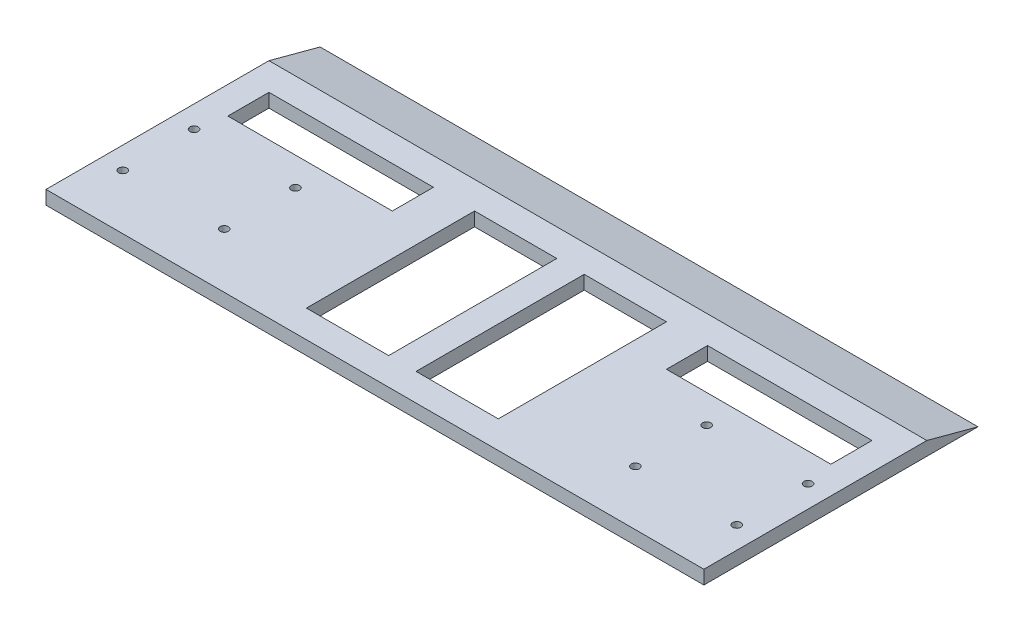
ISO-10303-21;
HEADER;
FILE_DESCRIPTION(('STEP AP214'),'2;1');
FILE_NAME('part.step','',(''),(''),'','','');
FILE_SCHEMA(('AUTOMOTIVE_DESIGN { 1 0 10303 214 1 1 1 1 }'));
ENDSEC;
DATA;
#1=APPLICATION_CONTEXT('core data for automotive mechanical design processes');
#2=APPLICATION_PROTOCOL_DEFINITION('international standard','automotive_design',2000,#1);
#3=PRODUCT_CONTEXT('',#1,'mechanical');
#4=PRODUCT('Part','Part','',(#3));
#5=PRODUCT_RELATED_PRODUCT_CATEGORY('part','',(#4));
#6=PRODUCT_DEFINITION_FORMATION('','',#4);
#7=PRODUCT_DEFINITION_CONTEXT('part definition',#1,'design');
#8=PRODUCT_DEFINITION('design','',#6,#7);
#9=PRODUCT_DEFINITION_SHAPE('','',#8);
#10=(LENGTH_UNIT() NAMED_UNIT(*) SI_UNIT(.MILLI.,.METRE.));
#11=(NAMED_UNIT(*) PLANE_ANGLE_UNIT() SI_UNIT($,.RADIAN.));
#12=(NAMED_UNIT(*) SI_UNIT($,.STERADIAN.) SOLID_ANGLE_UNIT());
#13=UNCERTAINTY_MEASURE_WITH_UNIT(LENGTH_MEASURE(1.E-05),#10,'distance_accuracy_value','');
#14=(GEOMETRIC_REPRESENTATION_CONTEXT(3) GLOBAL_UNCERTAINTY_ASSIGNED_CONTEXT((#13)) GLOBAL_UNIT_ASSIGNED_CONTEXT((#10,
#11,#12)) REPRESENTATION_CONTEXT('',''));
#15=CARTESIAN_POINT('',(0.,0.,0.));
#16=DIRECTION('',(0.,0.,1.));
#17=DIRECTION('',(1.,0.,0.));
#18=AXIS2_PLACEMENT_3D('',#15,#16,#17);
#19=CARTESIAN_POINT('',(85.,-7.5,28.6602540378449));
#20=DIRECTION('',(0.,0.,-1.));
#21=DIRECTION('',(-1.,0.,0.));
#22=AXIS2_PLACEMENT_3D('',#19,#20,#21);
#23=PLANE('',#22);
#24=DIRECTION('',(0.,-1.,0.));
#25=VECTOR('',#24,1.);
#26=CARTESIAN_POINT('',(115.,2.49999999999999,28.6602540378449));
#27=LINE('',#26,#25);
#28=CARTESIAN_POINT('',(115.,2.49999999999999,28.6602540378449));
#29=VERTEX_POINT('',#28);
#30=CARTESIAN_POINT('',(115.,-2.5,28.6602540378449));
#31=VERTEX_POINT('',#30);
#32=EDGE_CURVE('E187',#29,#31,#27,.T.);
#33=ORIENTED_EDGE('',*,*,#32,.F.);
#34=DIRECTION('',(-1.,0.,0.));
#35=VECTOR('',#34,1.);
#36=CARTESIAN_POINT('',(85.,2.5,28.6602540378449));
#37=LINE('',#36,#35);
#38=CARTESIAN_POINT('',(85.,2.5,28.6602540378449));
#39=VERTEX_POINT('',#38);
#40=EDGE_CURVE('E175',#29,#39,#37,.T.);
#41=ORIENTED_EDGE('',*,*,#40,.T.);
#42=DIRECTION('',(0.,1.,0.));
#43=VECTOR('',#42,1.);
#44=CARTESIAN_POINT('',(85.,-7.5,28.6602540378449));
#45=LINE('',#44,#43);
#46=CARTESIAN_POINT('',(85.,-2.5,28.6602540378449));
#47=VERTEX_POINT('',#46);
#48=EDGE_CURVE('E252',#47,#39,#45,.T.);
#49=ORIENTED_EDGE('',*,*,#48,.F.);
#50=DIRECTION('',(-1.,0.,0.));
#51=VECTOR('',#50,1.);
#52=CARTESIAN_POINT('',(0.,-2.5,28.6602540378449));
#53=LINE('',#52,#51);
#54=EDGE_CURVE('E52',#31,#47,#53,.T.);
#55=ORIENTED_EDGE('',*,*,#54,.F.);
#56=EDGE_LOOP('',(#33,#41,#49,#55));
#57=FACE_BOUND('',#56,.T.);
#58=ADVANCED_FACE('F36',(#57),#23,.F.);
#59=DIRECTION('',(0.,1.,0.));
#60=VECTOR('',#59,1.);
#61=CARTESIAN_POINT('',(125.,2.5,28.6602540378449));
#62=LINE('',#61,#60);
#63=CARTESIAN_POINT('',(125.,-2.5,28.6602540378449));
#64=VERTEX_POINT('',#63);
#65=CARTESIAN_POINT('',(125.,2.5,28.6602540378449));
#66=VERTEX_POINT('',#65);
#67=EDGE_CURVE('E60',#64,#66,#62,.T.);
#68=ORIENTED_EDGE('',*,*,#67,.F.);
#69=CARTESIAN_POINT('',(155.,-2.5,28.6602540378449));
#70=VERTEX_POINT('',#69);
#71=EDGE_CURVE('E322',#70,#64,#53,.T.);
#72=ORIENTED_EDGE('',*,*,#71,.F.);
#73=DIRECTION('',(0.,1.,0.));
#74=VECTOR('',#73,1.);
#75=CARTESIAN_POINT('',(155.,-7.5,28.6602540378449));
#76=LINE('',#75,#74);
#77=CARTESIAN_POINT('',(155.,2.5,28.6602540378449));
#78=VERTEX_POINT('',#77);
#79=EDGE_CURVE('E255',#70,#78,#76,.T.);
#80=ORIENTED_EDGE('',*,*,#79,.T.);
#81=EDGE_CURVE('E183',#78,#66,#37,.T.);
#82=ORIENTED_EDGE('',*,*,#81,.T.);
#83=EDGE_LOOP('',(#68,#72,#80,#82));
#84=FACE_BOUND('',#83,.T.);
#85=ADVANCED_FACE('F452',(#84),#23,.F.);
#86=CARTESIAN_POINT('',(85.,-7.5,90.));
#87=DIRECTION('',(0.,0.,1.));
#88=DIRECTION('',(1.,0.,0.));
#89=AXIS2_PLACEMENT_3D('',#86,#87,#88);
#90=PLANE('',#89);
#91=DIRECTION('',(0.,1.,0.));
#92=VECTOR('',#91,1.);
#93=CARTESIAN_POINT('',(115.,-7.5,90.));
#94=LINE('',#93,#92);
#95=CARTESIAN_POINT('',(115.,-2.5,90.));
#96=VERTEX_POINT('',#95);
#97=CARTESIAN_POINT('',(115.,2.5,90.));
#98=VERTEX_POINT('',#97);
#99=EDGE_CURVE('E193',#96,#98,#94,.T.);
#100=ORIENTED_EDGE('',*,*,#99,.F.);
#101=DIRECTION('',(1.,0.,0.));
#102=VECTOR('',#101,1.);
#103=CARTESIAN_POINT('',(0.,-2.5,90.));
#104=LINE('',#103,#102);
#105=CARTESIAN_POINT('',(85.,-2.5,90.));
#106=VERTEX_POINT('',#105);
#107=EDGE_CURVE('E316',#106,#96,#104,.T.);
#108=ORIENTED_EDGE('',*,*,#107,.F.);
#109=DIRECTION('',(0.,1.,0.));
#110=VECTOR('',#109,1.);
#111=CARTESIAN_POINT('',(85.,-7.5,90.));
#112=LINE('',#111,#110);
#113=CARTESIAN_POINT('',(85.,2.5,90.));
#114=VERTEX_POINT('',#113);
#115=EDGE_CURVE('E251',#106,#114,#112,.T.);
#116=ORIENTED_EDGE('',*,*,#115,.T.);
#117=DIRECTION('',(1.,0.,0.));
#118=VECTOR('',#117,1.);
#119=CARTESIAN_POINT('',(85.,2.5,90.));
#120=LINE('',#119,#118);
#121=EDGE_CURVE('E247',#114,#98,#120,.T.);
#122=ORIENTED_EDGE('',*,*,#121,.T.);
#123=EDGE_LOOP('',(#100,#108,#116,#122));
#124=FACE_BOUND('',#123,.T.);
#125=ADVANCED_FACE('F457',(#124),#90,.F.);
#126=DIRECTION('',(0.,-1.,0.));
#127=VECTOR('',#126,1.);
#128=CARTESIAN_POINT('',(125.,-7.5,90.));
#129=LINE('',#128,#127);
#130=CARTESIAN_POINT('',(125.,2.5,90.));
#131=VERTEX_POINT('',#130);
#132=CARTESIAN_POINT('',(125.,-2.5,90.));
#133=VERTEX_POINT('',#132);
#134=EDGE_CURVE('E351',#131,#133,#129,.T.);
#135=ORIENTED_EDGE('',*,*,#134,.F.);
#136=CARTESIAN_POINT('',(155.,2.5,90.));
#137=VERTEX_POINT('',#136);
#138=EDGE_CURVE('E246',#131,#137,#120,.T.);
#139=ORIENTED_EDGE('',*,*,#138,.T.);
#140=DIRECTION('',(0.,1.,0.));
#141=VECTOR('',#140,1.);
#142=CARTESIAN_POINT('',(155.,-7.5,90.));
#143=LINE('',#142,#141);
#144=CARTESIAN_POINT('',(155.,-2.5,90.));
#145=VERTEX_POINT('',#144);
#146=EDGE_CURVE('E257',#145,#137,#143,.T.);
#147=ORIENTED_EDGE('',*,*,#146,.F.);
#148=EDGE_CURVE('E315',#133,#145,#104,.T.);
#149=ORIENTED_EDGE('',*,*,#148,.F.);
#150=EDGE_LOOP('',(#135,#139,#147,#149));
#151=FACE_BOUND('',#150,.T.);
#152=ADVANCED_FACE('F469',(#151),#90,.F.);
#153=CARTESIAN_POINT('',(0.,2.5,0.));
#154=DIRECTION('',(1.,0.,0.));
#155=DIRECTION('',(0.,0.,-1.));
#156=AXIS2_PLACEMENT_3D('',#153,#154,#155);
#157=PLANE('',#156);
#158=DIRECTION('',(0.,0.,1.));
#159=VECTOR('',#158,1.);
#160=CARTESIAN_POINT('',(0.,2.5,0.));
#161=LINE('',#160,#159);
#162=CARTESIAN_POINT('',(0.,2.5,18.6602540378449));
#163=VERTEX_POINT('',#162);
#164=CARTESIAN_POINT('',(0.,2.5,100.));
#165=VERTEX_POINT('',#164);
#166=EDGE_CURVE('E293',#163,#165,#161,.T.);
#167=ORIENTED_EDGE('',*,*,#166,.F.);
#168=DIRECTION('',(0.,-0.258819045102514,-0.96592582628907));
#169=VECTOR('',#168,1.);
#170=CARTESIAN_POINT('',(0.,-2.5,0.));
#171=LINE('',#170,#169);
#172=CARTESIAN_POINT('',(0.,-2.5,0.));
#173=VERTEX_POINT('',#172);
#174=EDGE_CURVE('E286',#163,#173,#171,.T.);
#175=ORIENTED_EDGE('',*,*,#174,.T.);
#176=DIRECTION('',(0.,0.,1.));
#177=VECTOR('',#176,1.);
#178=CARTESIAN_POINT('',(0.,-2.5,0.));
#179=LINE('',#178,#177);
#180=CARTESIAN_POINT('',(0.,-2.5,100.));
#181=VERTEX_POINT('',#180);
#182=EDGE_CURVE('E292',#173,#181,#179,.T.);
#183=ORIENTED_EDGE('',*,*,#182,.T.);
#184=DIRECTION('',(0.,-1.,0.));
#185=VECTOR('',#184,1.);
#186=CARTESIAN_POINT('',(0.,2.5,100.));
#187=LINE('',#186,#185);
#188=EDGE_CURVE('E312',#165,#181,#187,.T.);
#189=ORIENTED_EDGE('',*,*,#188,.F.);
#190=EDGE_LOOP('',(#167,#175,#183,#189));
#191=FACE_BOUND('',#190,.T.);
#192=ADVANCED_FACE('F516',(#191),#157,.F.);
#193=CARTESIAN_POINT('',(0.,2.5,100.));
#194=DIRECTION('',(0.,0.,-1.));
#195=DIRECTION('',(-1.,0.,0.));
#196=AXIS2_PLACEMENT_3D('',#193,#194,#195);
#197=PLANE('',#196);
#198=DIRECTION('',(1.,0.,0.));
#199=VECTOR('',#198,1.);
#200=CARTESIAN_POINT('',(0.,-2.5,100.));
#201=LINE('',#200,#199);
#202=CARTESIAN_POINT('',(240.,-2.5,100.));
#203=VERTEX_POINT('',#202);
#204=EDGE_CURVE('E304',#181,#203,#201,.T.);
#205=ORIENTED_EDGE('',*,*,#204,.T.);
#206=DIRECTION('',(0.,-1.,0.));
#207=VECTOR('',#206,1.);
#208=CARTESIAN_POINT('',(240.,2.5,100.));
#209=LINE('',#208,#207);
#210=CARTESIAN_POINT('',(240.,2.5,100.));
#211=VERTEX_POINT('',#210);
#212=EDGE_CURVE('E301',#211,#203,#209,.T.);
#213=ORIENTED_EDGE('',*,*,#212,.F.);
#214=DIRECTION('',(1.,0.,0.));
#215=VECTOR('',#214,1.);
#216=CARTESIAN_POINT('',(0.,2.5,100.));
#217=LINE('',#216,#215);
#218=EDGE_CURVE('E295',#165,#211,#217,.T.);
#219=ORIENTED_EDGE('',*,*,#218,.F.);
#220=ORIENTED_EDGE('',*,*,#188,.T.);
#221=EDGE_LOOP('',(#205,#213,#219,#220));
#222=FACE_BOUND('',#221,.T.);
#223=ADVANCED_FACE('F512',(#222),#197,.F.);
#224=CARTESIAN_POINT('',(240.,2.5,0.));
#225=DIRECTION('',(-1.,0.,0.));
#226=DIRECTION('',(0.,0.,1.));
#227=AXIS2_PLACEMENT_3D('',#224,#225,#226);
#228=PLANE('',#227);
#229=DIRECTION('',(0.,0.,-1.));
#230=VECTOR('',#229,1.);
#231=CARTESIAN_POINT('',(240.,-2.5,0.));
#232=LINE('',#231,#230);
#233=CARTESIAN_POINT('',(240.,-2.5,0.));
#234=VERTEX_POINT('',#233);
#235=EDGE_CURVE('E306',#203,#234,#232,.T.);
#236=ORIENTED_EDGE('',*,*,#235,.T.);
#237=DIRECTION('',(0.,-0.258819045102514,-0.96592582628907));
#238=VECTOR('',#237,1.);
#239=CARTESIAN_POINT('',(240.,-2.5,0.));
#240=LINE('',#239,#238);
#241=CARTESIAN_POINT('',(240.,2.5,18.6602540378449));
#242=VERTEX_POINT('',#241);
#243=EDGE_CURVE('E285',#242,#234,#240,.T.);
#244=ORIENTED_EDGE('',*,*,#243,.F.);
#245=DIRECTION('',(0.,0.,-1.));
#246=VECTOR('',#245,1.);
#247=CARTESIAN_POINT('',(240.,2.5,0.));
#248=LINE('',#247,#246);
#249=EDGE_CURVE('E298',#211,#242,#248,.T.);
#250=ORIENTED_EDGE('',*,*,#249,.F.);
#251=ORIENTED_EDGE('',*,*,#212,.T.);
#252=EDGE_LOOP('',(#236,#244,#250,#251));
#253=FACE_BOUND('',#252,.T.);
#254=ADVANCED_FACE('F508',(#253),#228,.F.);
#255=CARTESIAN_POINT('',(0.,2.5,0.));
#256=DIRECTION('',(0.,1.,0.));
#257=DIRECTION('',(0.,0.,1.));
#258=AXIS2_PLACEMENT_3D('',#255,#256,#257);
#259=PLANE('',#258);
#260=DIRECTION('',(0.,0.,-1.));
#261=VECTOR('',#260,1.);
#262=CARTESIAN_POINT('',(115.,2.49999999999999,98.6602540378449));
#263=LINE('',#262,#261);
#264=EDGE_CURVE('E180',#98,#29,#263,.T.);
#265=ORIENTED_EDGE('',*,*,#264,.F.);
#266=ORIENTED_EDGE('',*,*,#121,.F.);
#267=DIRECTION('',(0.,0.,1.));
#268=VECTOR('',#267,1.);
#269=CARTESIAN_POINT('',(85.,2.5,28.6602540378449));
#270=LINE('',#269,#268);
#271=EDGE_CURVE('E181',#39,#114,#270,.T.);
#272=ORIENTED_EDGE('',*,*,#271,.F.);
#273=ORIENTED_EDGE('',*,*,#40,.F.);
#274=EDGE_LOOP('',(#265,#266,#272,#273));
#275=FACE_BOUND('',#274,.T.);
#276=ORIENTED_EDGE('',*,*,#138,.F.);
#277=DIRECTION('',(0.,0.,-1.));
#278=VECTOR('',#277,1.);
#279=CARTESIAN_POINT('',(125.,2.5,98.6602540378449));
#280=LINE('',#279,#278);
#281=EDGE_CURVE('E194',#131,#66,#280,.T.);
#282=ORIENTED_EDGE('',*,*,#281,.T.);
#283=ORIENTED_EDGE('',*,*,#81,.F.);
#284=DIRECTION('',(0.,0.,-1.));
#285=VECTOR('',#284,1.);
#286=CARTESIAN_POINT('',(155.,2.5,28.6602540378449));
#287=LINE('',#286,#285);
#288=EDGE_CURVE('E184',#137,#78,#287,.T.);
#289=ORIENTED_EDGE('',*,*,#288,.F.);
#290=EDGE_LOOP('',(#276,#282,#283,#289));
#291=FACE_BOUND('',#290,.T.);
#292=DIRECTION('',(0.,0.,-1.));
#293=VECTOR('',#292,1.);
#294=CARTESIAN_POINT('',(70.,2.5,28.6602540378449));
#295=LINE('',#294,#293);
#296=CARTESIAN_POINT('',(70.,2.5,43.6602540378449));
#297=VERTEX_POINT('',#296);
#298=CARTESIAN_POINT('',(70.,2.5,28.6602540378449));
#299=VERTEX_POINT('',#298);
#300=EDGE_CURVE('E206',#297,#299,#295,.T.);
#301=ORIENTED_EDGE('',*,*,#300,.F.);
#302=DIRECTION('',(1.,0.,0.));
#303=VECTOR('',#302,1.);
#304=CARTESIAN_POINT('',(70.,2.5,43.6602540378449));
#305=LINE('',#304,#303);
#306=CARTESIAN_POINT('',(10.,2.5,43.6602540378449));
#307=VERTEX_POINT('',#306);
#308=EDGE_CURVE('E215',#307,#297,#305,.T.);
#309=ORIENTED_EDGE('',*,*,#308,.F.);
#310=DIRECTION('',(0.,0.,1.));
#311=VECTOR('',#310,1.);
#312=CARTESIAN_POINT('',(10.,2.5,28.6602540378449));
#313=LINE('',#312,#311);
#314=CARTESIAN_POINT('',(10.,2.5,28.6602540378449));
#315=VERTEX_POINT('',#314);
#316=EDGE_CURVE('E212',#315,#307,#313,.T.);
#317=ORIENTED_EDGE('',*,*,#316,.F.);
#318=DIRECTION('',(-1.,0.,0.));
#319=VECTOR('',#318,1.);
#320=CARTESIAN_POINT('',(70.,2.5,28.6602540378449));
#321=LINE('',#320,#319);
#322=EDGE_CURVE('E208',#299,#315,#321,.T.);
#323=ORIENTED_EDGE('',*,*,#322,.F.);
#324=EDGE_LOOP('',(#301,#309,#317,#323));
#325=FACE_BOUND('',#324,.T.);
#326=DIRECTION('',(0.,0.,1.));
#327=VECTOR('',#326,1.);
#328=CARTESIAN_POINT('',(170.,2.5,28.6602540378449));
#329=LINE('',#328,#327);
#330=CARTESIAN_POINT('',(170.,2.5,28.6602540378449));
#331=VERTEX_POINT('',#330);
#332=CARTESIAN_POINT('',(170.,2.5,43.6602540378449));
#333=VERTEX_POINT('',#332);
#334=EDGE_CURVE('E205',#331,#333,#329,.T.);
#335=ORIENTED_EDGE('',*,*,#334,.F.);
#336=DIRECTION('',(-1.,0.,0.));
#337=VECTOR('',#336,1.);
#338=CARTESIAN_POINT('',(170.,2.5,28.6602540378449));
#339=LINE('',#338,#337);
#340=CARTESIAN_POINT('',(230.,2.5,28.6602540378449));
#341=VERTEX_POINT('',#340);
#342=EDGE_CURVE('E234',#341,#331,#339,.T.);
#343=ORIENTED_EDGE('',*,*,#342,.F.);
#344=DIRECTION('',(0.,0.,-1.));
#345=VECTOR('',#344,1.);
#346=CARTESIAN_POINT('',(230.,2.5,28.6602540378449));
#347=LINE('',#346,#345);
#348=CARTESIAN_POINT('',(230.,2.5,43.6602540378449));
#349=VERTEX_POINT('',#348);
#350=EDGE_CURVE('E231',#349,#341,#347,.T.);
#351=ORIENTED_EDGE('',*,*,#350,.F.);
#352=DIRECTION('',(1.,0.,0.));
#353=VECTOR('',#352,1.);
#354=CARTESIAN_POINT('',(170.,2.5,43.6602540378449));
#355=LINE('',#354,#353);
#356=EDGE_CURVE('E228',#333,#349,#355,.T.);
#357=ORIENTED_EDGE('',*,*,#356,.F.);
#358=EDGE_LOOP('',(#335,#343,#351,#357));
#359=FACE_BOUND('',#358,.T.);
#360=CARTESIAN_POINT('',(195.,2.5,80.));
#361=DIRECTION('',(0.,1.,0.));
#362=DIRECTION('',(0.,0.,-1.));
#363=AXIS2_PLACEMENT_3D('',#360,#361,#362);
#364=CIRCLE('',#363,1.50000000000003);
#365=CARTESIAN_POINT('',(195.,2.5,78.5));
#366=VERTEX_POINT('',#365);
#367=EDGE_CURVE('E268',#366,#366,#364,.T.);
#368=ORIENTED_EDGE('',*,*,#367,.F.);
#369=EDGE_LOOP('',(#368));
#370=FACE_BOUND('',#369,.T.);
#371=CARTESIAN_POINT('',(8.00000000000001,2.5,54.));
#372=DIRECTION('',(0.,1.,0.));
#373=DIRECTION('',(0.,0.,1.));
#374=AXIS2_PLACEMENT_3D('',#371,#372,#373);
#375=CIRCLE('',#374,1.5);
#376=CARTESIAN_POINT('',(8.00000000000001,2.5,55.5));
#377=VERTEX_POINT('',#376);
#378=EDGE_CURVE('E271',#377,#377,#375,.T.);
#379=ORIENTED_EDGE('',*,*,#378,.F.);
#380=EDGE_LOOP('',(#379));
#381=FACE_BOUND('',#380,.T.);
#382=CARTESIAN_POINT('',(8.00000000000001,2.5,80.));
#383=DIRECTION('',(0.,1.,0.));
#384=DIRECTION('',(0.,0.,-1.));
#385=AXIS2_PLACEMENT_3D('',#382,#383,#384);
#386=CIRCLE('',#385,1.5);
#387=CARTESIAN_POINT('',(8.00000000000001,2.5,78.5));
#388=VERTEX_POINT('',#387);
#389=EDGE_CURVE('E274',#388,#388,#386,.T.);
#390=ORIENTED_EDGE('',*,*,#389,.F.);
#391=EDGE_LOOP('',(#390));
#392=FACE_BOUND('',#391,.T.);
#393=CARTESIAN_POINT('',(45.,2.5,54.));
#394=DIRECTION('',(0.,1.,0.));
#395=DIRECTION('',(0.,0.,-1.));
#396=AXIS2_PLACEMENT_3D('',#393,#394,#395);
#397=CIRCLE('',#396,1.5);
#398=CARTESIAN_POINT('',(45.,2.5,52.5));
#399=VERTEX_POINT('',#398);
#400=EDGE_CURVE('E277',#399,#399,#397,.T.);
#401=ORIENTED_EDGE('',*,*,#400,.F.);
#402=EDGE_LOOP('',(#401));
#403=FACE_BOUND('',#402,.T.);
#404=CARTESIAN_POINT('',(232.,2.5,54.));
#405=DIRECTION('',(0.,1.,0.));
#406=DIRECTION('',(0.,0.,-1.));
#407=AXIS2_PLACEMENT_3D('',#404,#405,#406);
#408=CIRCLE('',#407,1.5);
#409=CARTESIAN_POINT('',(232.,2.5,52.5));
#410=VERTEX_POINT('',#409);
#411=EDGE_CURVE('E254',#410,#410,#408,.T.);
#412=ORIENTED_EDGE('',*,*,#411,.F.);
#413=EDGE_LOOP('',(#412));
#414=FACE_BOUND('',#413,.T.);
#415=CARTESIAN_POINT('',(232.,2.5,80.));
#416=DIRECTION('',(0.,1.,0.));
#417=DIRECTION('',(0.,0.,1.));
#418=AXIS2_PLACEMENT_3D('',#415,#416,#417);
#419=CIRCLE('',#418,1.5);
#420=CARTESIAN_POINT('',(232.,2.5,81.5));
#421=VERTEX_POINT('',#420);
#422=EDGE_CURVE('E264',#421,#421,#419,.T.);
#423=ORIENTED_EDGE('',*,*,#422,.F.);
#424=EDGE_LOOP('',(#423));
#425=FACE_BOUND('',#424,.T.);
#426=CARTESIAN_POINT('',(195.,2.5,54.));
#427=DIRECTION('',(0.,1.,0.));
#428=DIRECTION('',(0.,0.,1.));
#429=AXIS2_PLACEMENT_3D('',#426,#427,#428);
#430=CIRCLE('',#429,1.50000000000003);
#431=CARTESIAN_POINT('',(195.,2.5,55.5));
#432=VERTEX_POINT('',#431);
#433=EDGE_CURVE('E265',#432,#432,#430,.T.);
#434=ORIENTED_EDGE('',*,*,#433,.F.);
#435=EDGE_LOOP('',(#434));
#436=FACE_BOUND('',#435,.T.);
#437=CARTESIAN_POINT('',(45.,2.5,80.));
#438=DIRECTION('',(0.,1.,0.));
#439=DIRECTION('',(0.,0.,1.));
#440=AXIS2_PLACEMENT_3D('',#437,#438,#439);
#441=CIRCLE('',#440,1.5);
#442=CARTESIAN_POINT('',(45.,2.5,81.5));
#443=VERTEX_POINT('',#442);
#444=EDGE_CURVE('E280',#443,#443,#441,.T.);
#445=ORIENTED_EDGE('',*,*,#444,.F.);
#446=EDGE_LOOP('',(#445));
#447=FACE_BOUND('',#446,.T.);
#448=DIRECTION('',(1.,0.,0.));
#449=VECTOR('',#448,1.);
#450=CARTESIAN_POINT('',(0.,2.5,18.6602540378449));
#451=LINE('',#450,#449);
#452=EDGE_CURVE('E289',#163,#242,#451,.T.);
#453=ORIENTED_EDGE('',*,*,#452,.F.);
#454=ORIENTED_EDGE('',*,*,#166,.T.);
#455=ORIENTED_EDGE('',*,*,#218,.T.);
#456=ORIENTED_EDGE('',*,*,#249,.T.);
#457=EDGE_LOOP('',(#453,#454,#455,#456));
#458=FACE_BOUND('',#457,.T.);
#459=ADVANCED_FACE('F176',(#275,#291,#325,#359,#370,#381,#392,#403,#414,#425,#436,#447,#458),
#259,.T.);
#460=CARTESIAN_POINT('',(0.,-2.5,0.));
#461=DIRECTION('',(0.,1.,0.));
#462=DIRECTION('',(0.,0.,1.));
#463=AXIS2_PLACEMENT_3D('',#460,#461,#462);
#464=PLANE('',#463);
#465=CARTESIAN_POINT('',(232.,-2.5,80.));
#466=DIRECTION('',(0.,1.,0.));
#467=DIRECTION('',(0.,0.,1.));
#468=AXIS2_PLACEMENT_3D('',#465,#466,#467);
#469=CIRCLE('',#468,2.61999999999998);
#470=CARTESIAN_POINT('',(232.,-2.5,82.62));
#471=VERTEX_POINT('',#470);
#472=EDGE_CURVE('E376',#471,#471,#469,.T.);
#473=ORIENTED_EDGE('',*,*,#472,.T.);
#474=EDGE_LOOP('',(#473));
#475=FACE_BOUND('',#474,.T.);
#476=CARTESIAN_POINT('',(232.,-2.5,54.));
#477=DIRECTION('',(0.,1.,0.));
#478=DIRECTION('',(0.,0.,1.));
#479=AXIS2_PLACEMENT_3D('',#476,#477,#478);
#480=CIRCLE('',#479,2.61999999999998);
#481=CARTESIAN_POINT('',(232.,-2.5,56.62));
#482=VERTEX_POINT('',#481);
#483=EDGE_CURVE('E373',#482,#482,#480,.T.);
#484=ORIENTED_EDGE('',*,*,#483,.T.);
#485=EDGE_LOOP('',(#484));
#486=FACE_BOUND('',#485,.T.);
#487=CARTESIAN_POINT('',(195.,-2.5,54.));
#488=DIRECTION('',(0.,1.,0.));
#489=DIRECTION('',(0.,0.,1.));
#490=AXIS2_PLACEMENT_3D('',#487,#488,#489);
#491=CIRCLE('',#490,2.62000000000007);
#492=CARTESIAN_POINT('',(195.,-2.5,56.6200000000001));
#493=VERTEX_POINT('',#492);
#494=EDGE_CURVE('E370',#493,#493,#491,.T.);
#495=ORIENTED_EDGE('',*,*,#494,.T.);
#496=EDGE_LOOP('',(#495));
#497=FACE_BOUND('',#496,.T.);
#498=CARTESIAN_POINT('',(195.,-2.5,80.));
#499=DIRECTION('',(0.,1.,0.));
#500=DIRECTION('',(0.,0.,1.));
#501=AXIS2_PLACEMENT_3D('',#498,#499,#500);
#502=CIRCLE('',#501,2.62000000000004);
#503=CARTESIAN_POINT('',(195.,-2.5,82.62));
#504=VERTEX_POINT('',#503);
#505=EDGE_CURVE('E367',#504,#504,#502,.T.);
#506=ORIENTED_EDGE('',*,*,#505,.T.);
#507=EDGE_LOOP('',(#506));
#508=FACE_BOUND('',#507,.T.);
#509=CARTESIAN_POINT('',(45.,-2.5,80.));
#510=DIRECTION('',(0.,1.,0.));
#511=DIRECTION('',(0.,0.,1.));
#512=AXIS2_PLACEMENT_3D('',#509,#510,#511);
#513=CIRCLE('',#512,2.61999999999998);
#514=CARTESIAN_POINT('',(45.,-2.5,82.62));
#515=VERTEX_POINT('',#514);
#516=EDGE_CURVE('E364',#515,#515,#513,.T.);
#517=ORIENTED_EDGE('',*,*,#516,.T.);
#518=EDGE_LOOP('',(#517));
#519=FACE_BOUND('',#518,.T.);
#520=CARTESIAN_POINT('',(8.00000000000001,-2.5,80.));
#521=DIRECTION('',(0.,1.,0.));
#522=DIRECTION('',(0.,0.,1.));
#523=AXIS2_PLACEMENT_3D('',#520,#521,#522);
#524=CIRCLE('',#523,2.61999999999998);
#525=CARTESIAN_POINT('',(8.00000000000001,-2.5,82.62));
#526=VERTEX_POINT('',#525);
#527=EDGE_CURVE('E361',#526,#526,#524,.T.);
#528=ORIENTED_EDGE('',*,*,#527,.T.);
#529=EDGE_LOOP('',(#528));
#530=FACE_BOUND('',#529,.T.);
#531=CARTESIAN_POINT('',(8.00000000000001,-2.5,54.));
#532=DIRECTION('',(0.,1.,0.));
#533=DIRECTION('',(0.,0.,1.));
#534=AXIS2_PLACEMENT_3D('',#531,#532,#533);
#535=CIRCLE('',#534,2.61999999999998);
#536=CARTESIAN_POINT('',(8.00000000000001,-2.5,56.62));
#537=VERTEX_POINT('',#536);
#538=EDGE_CURVE('E358',#537,#537,#535,.T.);
#539=ORIENTED_EDGE('',*,*,#538,.T.);
#540=EDGE_LOOP('',(#539));
#541=FACE_BOUND('',#540,.T.);
#542=CARTESIAN_POINT('',(45.,-2.5,54.));
#543=DIRECTION('',(0.,1.,0.));
#544=DIRECTION('',(0.,0.,1.));
#545=AXIS2_PLACEMENT_3D('',#542,#543,#544);
#546=CIRCLE('',#545,2.61999999999998);
#547=CARTESIAN_POINT('',(45.,-2.5,56.62));
#548=VERTEX_POINT('',#547);
#549=EDGE_CURVE('E355',#548,#548,#546,.T.);
#550=ORIENTED_EDGE('',*,*,#549,.T.);
#551=EDGE_LOOP('',(#550));
#552=FACE_BOUND('',#551,.T.);
#553=ORIENTED_EDGE('',*,*,#107,.T.);
#554=DIRECTION('',(0.,0.,-1.));
#555=VECTOR('',#554,1.);
#556=CARTESIAN_POINT('',(115.,-2.5,98.6602540378449));
#557=LINE('',#556,#555);
#558=EDGE_CURVE('E203',#96,#31,#557,.T.);
#559=ORIENTED_EDGE('',*,*,#558,.T.);
#560=ORIENTED_EDGE('',*,*,#54,.T.);
#561=DIRECTION('',(0.,0.,1.));
#562=VECTOR('',#561,1.);
#563=CARTESIAN_POINT('',(85.,-2.5,0.));
#564=LINE('',#563,#562);
#565=EDGE_CURVE('E324',#47,#106,#564,.T.);
#566=ORIENTED_EDGE('',*,*,#565,.T.);
#567=EDGE_LOOP('',(#553,#559,#560,#566));
#568=FACE_BOUND('',#567,.T.);
#569=DIRECTION('',(0.,0.,-1.));
#570=VECTOR('',#569,1.);
#571=CARTESIAN_POINT('',(125.,-2.50000000000001,98.6602540378449));
#572=LINE('',#571,#570);
#573=EDGE_CURVE('E197',#133,#64,#572,.T.);
#574=ORIENTED_EDGE('',*,*,#573,.F.);
#575=ORIENTED_EDGE('',*,*,#148,.T.);
#576=DIRECTION('',(0.,0.,-1.));
#577=VECTOR('',#576,1.);
#578=CARTESIAN_POINT('',(155.,-2.5,0.));
#579=LINE('',#578,#577);
#580=EDGE_CURVE('E319',#145,#70,#579,.T.);
#581=ORIENTED_EDGE('',*,*,#580,.T.);
#582=ORIENTED_EDGE('',*,*,#71,.T.);
#583=EDGE_LOOP('',(#574,#575,#581,#582));
#584=FACE_BOUND('',#583,.T.);
#585=ORIENTED_EDGE('',*,*,#182,.F.);
#586=DIRECTION('',(-1.,0.,0.));
#587=VECTOR('',#586,1.);
#588=CARTESIAN_POINT('',(0.,-2.5,0.));
#589=LINE('',#588,#587);
#590=EDGE_CURVE('E296',#234,#173,#589,.T.);
#591=ORIENTED_EDGE('',*,*,#590,.F.);
#592=ORIENTED_EDGE('',*,*,#235,.F.);
#593=ORIENTED_EDGE('',*,*,#204,.F.);
#594=EDGE_LOOP('',(#585,#591,#592,#593));
#595=FACE_BOUND('',#594,.T.);
#596=DIRECTION('',(-1.,0.,0.));
#597=VECTOR('',#596,1.);
#598=CARTESIAN_POINT('',(0.,-2.5,28.6602540378449));
#599=LINE('',#598,#597);
#600=CARTESIAN_POINT('',(230.,-2.5,28.6602540378449));
#601=VERTEX_POINT('',#600);
#602=CARTESIAN_POINT('',(170.,-2.5,28.6602540378449));
#603=VERTEX_POINT('',#602);
#604=EDGE_CURVE('E333',#601,#603,#599,.T.);
#605=ORIENTED_EDGE('',*,*,#604,.T.);
#606=DIRECTION('',(0.,0.,1.));
#607=VECTOR('',#606,1.);
#608=CARTESIAN_POINT('',(170.,-2.5,0.));
#609=LINE('',#608,#607);
#610=CARTESIAN_POINT('',(170.,-2.5,43.6602540378449));
#611=VERTEX_POINT('',#610);
#612=EDGE_CURVE('E336',#603,#611,#609,.T.);
#613=ORIENTED_EDGE('',*,*,#612,.T.);
#614=DIRECTION('',(1.,0.,0.));
#615=VECTOR('',#614,1.);
#616=CARTESIAN_POINT('',(0.,-2.5,43.6602540378449));
#617=LINE('',#616,#615);
#618=CARTESIAN_POINT('',(230.,-2.5,43.6602540378449));
#619=VERTEX_POINT('',#618);
#620=EDGE_CURVE('E327',#611,#619,#617,.T.);
#621=ORIENTED_EDGE('',*,*,#620,.T.);
#622=DIRECTION('',(0.,0.,-1.));
#623=VECTOR('',#622,1.);
#624=CARTESIAN_POINT('',(230.,-2.5,0.));
#625=LINE('',#624,#623);
#626=EDGE_CURVE('E330',#619,#601,#625,.T.);
#627=ORIENTED_EDGE('',*,*,#626,.T.);
#628=EDGE_LOOP('',(#605,#613,#621,#627));
#629=FACE_BOUND('',#628,.T.);
#630=DIRECTION('',(1.,0.,0.));
#631=VECTOR('',#630,1.);
#632=CARTESIAN_POINT('',(0.,-2.5,43.6602540378449));
#633=LINE('',#632,#631);
#634=CARTESIAN_POINT('',(10.,-2.5,43.6602540378449));
#635=VERTEX_POINT('',#634);
#636=CARTESIAN_POINT('',(70.,-2.5,43.6602540378449));
#637=VERTEX_POINT('',#636);
#638=EDGE_CURVE('E345',#635,#637,#633,.T.);
#639=ORIENTED_EDGE('',*,*,#638,.T.);
#640=DIRECTION('',(0.,0.,-1.));
#641=VECTOR('',#640,1.);
#642=CARTESIAN_POINT('',(70.,-2.5,0.));
#643=LINE('',#642,#641);
#644=CARTESIAN_POINT('',(70.,-2.5,28.6602540378449));
#645=VERTEX_POINT('',#644);
#646=EDGE_CURVE('E348',#637,#645,#643,.T.);
#647=ORIENTED_EDGE('',*,*,#646,.T.);
#648=DIRECTION('',(-1.,0.,0.));
#649=VECTOR('',#648,1.);
#650=CARTESIAN_POINT('',(0.,-2.5,28.6602540378449));
#651=LINE('',#650,#649);
#652=CARTESIAN_POINT('',(10.,-2.5,28.6602540378449));
#653=VERTEX_POINT('',#652);
#654=EDGE_CURVE('E339',#645,#653,#651,.T.);
#655=ORIENTED_EDGE('',*,*,#654,.T.);
#656=DIRECTION('',(0.,0.,1.));
#657=VECTOR('',#656,1.);
#658=CARTESIAN_POINT('',(10.,-2.5,0.));
#659=LINE('',#658,#657);
#660=EDGE_CURVE('E342',#653,#635,#659,.T.);
#661=ORIENTED_EDGE('',*,*,#660,.T.);
#662=EDGE_LOOP('',(#639,#647,#655,#661));
#663=FACE_BOUND('',#662,.T.);
#664=ADVANCED_FACE('F408',(#475,#486,#497,#508,#519,#530,#541,#552,#568,#584,#595,#629,#663),
#464,.F.);
#665=CARTESIAN_POINT('',(0.,-2.5,0.));
#666=DIRECTION('',(0.,-0.96592582628907,0.258819045102514));
#667=DIRECTION('',(0.,-0.258819045102514,-0.96592582628907));
#668=AXIS2_PLACEMENT_3D('',#665,#666,#667);
#669=PLANE('',#668);
#670=ORIENTED_EDGE('',*,*,#243,.T.);
#671=ORIENTED_EDGE('',*,*,#590,.T.);
#672=ORIENTED_EDGE('',*,*,#174,.F.);
#673=ORIENTED_EDGE('',*,*,#452,.T.);
#674=EDGE_LOOP('',(#670,#671,#672,#673));
#675=FACE_BOUND('',#674,.T.);
#676=ADVANCED_FACE('F411',(#675),#669,.F.);
#677=CARTESIAN_POINT('',(45.,-2.5,80.));
#678=DIRECTION('',(0.,1.,0.));
#679=DIRECTION('',(0.,0.,1.));
#680=AXIS2_PLACEMENT_3D('',#677,#678,#679);
#681=CYLINDRICAL_SURFACE('',#680,1.5);
#682=CARTESIAN_POINT('',(45.,-1.38000000000004,80.));
#683=DIRECTION('',(0.,1.,0.));
#684=DIRECTION('',(0.,0.,1.));
#685=AXIS2_PLACEMENT_3D('',#682,#683,#684);
#686=CIRCLE('',#685,1.5);
#687=CARTESIAN_POINT('',(45.,-1.38000000000004,81.5));
#688=VERTEX_POINT('',#687);
#689=EDGE_CURVE('E391',#688,#688,#686,.F.);
#690=ORIENTED_EDGE('',*,*,#689,.T.);
#691=EDGE_LOOP('',(#690));
#692=FACE_BOUND('',#691,.T.);
#693=ORIENTED_EDGE('',*,*,#444,.T.);
#694=EDGE_LOOP('',(#693));
#695=FACE_BOUND('',#694,.T.);
#696=ADVANCED_FACE('F484',(#692,#695),#681,.F.);
#697=CARTESIAN_POINT('',(195.,-2.5,54.));
#698=DIRECTION('',(0.,1.,0.));
#699=DIRECTION('',(0.,0.,1.));
#700=AXIS2_PLACEMENT_3D('',#697,#698,#699);
#701=CYLINDRICAL_SURFACE('',#700,1.50000000000003);
#702=CARTESIAN_POINT('',(195.,-1.37999999999997,54.));
#703=DIRECTION('',(0.,1.,0.));
#704=DIRECTION('',(0.,0.,1.));
#705=AXIS2_PLACEMENT_3D('',#702,#703,#704);
#706=CIRCLE('',#705,1.50000000000003);
#707=CARTESIAN_POINT('',(195.,-1.37999999999997,55.5));
#708=VERTEX_POINT('',#707);
#709=EDGE_CURVE('E385',#708,#708,#706,.F.);
#710=ORIENTED_EDGE('',*,*,#709,.T.);
#711=EDGE_LOOP('',(#710));
#712=FACE_BOUND('',#711,.T.);
#713=ORIENTED_EDGE('',*,*,#433,.T.);
#714=EDGE_LOOP('',(#713));
#715=FACE_BOUND('',#714,.T.);
#716=ADVANCED_FACE('F481',(#712,#715),#701,.F.);
#717=CARTESIAN_POINT('',(232.,-2.5,80.));
#718=DIRECTION('',(0.,1.,0.));
#719=DIRECTION('',(0.,0.,1.));
#720=AXIS2_PLACEMENT_3D('',#717,#718,#719);
#721=CYLINDRICAL_SURFACE('',#720,1.5);
#722=CARTESIAN_POINT('',(232.,-1.38000000000004,80.));
#723=DIRECTION('',(0.,1.,0.));
#724=DIRECTION('',(0.,0.,1.));
#725=AXIS2_PLACEMENT_3D('',#722,#723,#724);
#726=CIRCLE('',#725,1.5);
#727=CARTESIAN_POINT('',(232.,-1.38000000000004,81.5));
#728=VERTEX_POINT('',#727);
#729=EDGE_CURVE('E379',#728,#728,#726,.F.);
#730=ORIENTED_EDGE('',*,*,#729,.T.);
#731=EDGE_LOOP('',(#730));
#732=FACE_BOUND('',#731,.T.);
#733=ORIENTED_EDGE('',*,*,#422,.T.);
#734=EDGE_LOOP('',(#733));
#735=FACE_BOUND('',#734,.T.);
#736=ADVANCED_FACE('F479',(#732,#735),#721,.F.);
#737=CARTESIAN_POINT('',(232.,-2.5,54.));
#738=DIRECTION('',(0.,1.,0.));
#739=DIRECTION('',(0.,0.,1.));
#740=AXIS2_PLACEMENT_3D('',#737,#738,#739);
#741=CYLINDRICAL_SURFACE('',#740,1.5);
#742=CARTESIAN_POINT('',(232.,-1.38000000000003,54.));
#743=DIRECTION('',(0.,1.,0.));
#744=DIRECTION('',(0.,0.,1.));
#745=AXIS2_PLACEMENT_3D('',#742,#743,#744);
#746=CIRCLE('',#745,1.5);
#747=CARTESIAN_POINT('',(232.,-1.38000000000003,55.5));
#748=VERTEX_POINT('',#747);
#749=EDGE_CURVE('E382',#748,#748,#746,.F.);
#750=ORIENTED_EDGE('',*,*,#749,.T.);
#751=EDGE_LOOP('',(#750));
#752=FACE_BOUND('',#751,.T.);
#753=ORIENTED_EDGE('',*,*,#411,.T.);
#754=EDGE_LOOP('',(#753));
#755=FACE_BOUND('',#754,.T.);
#756=ADVANCED_FACE('F475',(#752,#755),#741,.F.);
#757=CARTESIAN_POINT('',(45.,-2.5,54.));
#758=DIRECTION('',(0.,1.,0.));
#759=DIRECTION('',(0.,0.,1.));
#760=AXIS2_PLACEMENT_3D('',#757,#758,#759);
#761=CYLINDRICAL_SURFACE('',#760,1.5);
#762=CARTESIAN_POINT('',(45.,-1.38000000000003,54.));
#763=DIRECTION('',(0.,1.,0.));
#764=DIRECTION('',(0.,0.,1.));
#765=AXIS2_PLACEMENT_3D('',#762,#763,#764);
#766=CIRCLE('',#765,1.5);
#767=CARTESIAN_POINT('',(45.,-1.38000000000003,55.5));
#768=VERTEX_POINT('',#767);
#769=EDGE_CURVE('E11',#768,#768,#766,.F.);
#770=ORIENTED_EDGE('',*,*,#769,.T.);
#771=EDGE_LOOP('',(#770));
#772=FACE_BOUND('',#771,.T.);
#773=ORIENTED_EDGE('',*,*,#400,.T.);
#774=EDGE_LOOP('',(#773));
#775=FACE_BOUND('',#774,.T.);
#776=ADVANCED_FACE('F478',(#772,#775),#761,.F.);
#777=CARTESIAN_POINT('',(8.00000000000001,-2.5,80.));
#778=DIRECTION('',(0.,1.,0.));
#779=DIRECTION('',(0.,0.,1.));
#780=AXIS2_PLACEMENT_3D('',#777,#778,#779);
#781=CYLINDRICAL_SURFACE('',#780,1.5);
#782=CARTESIAN_POINT('',(8.00000000000001,-1.38000000000004,80.));
#783=DIRECTION('',(0.,1.,0.));
#784=DIRECTION('',(0.,0.,1.));
#785=AXIS2_PLACEMENT_3D('',#782,#783,#784);
#786=CIRCLE('',#785,1.5);
#787=CARTESIAN_POINT('',(8.00000000000001,-1.38000000000004,81.5));
#788=VERTEX_POINT('',#787);
#789=EDGE_CURVE('E394',#788,#788,#786,.F.);
#790=ORIENTED_EDGE('',*,*,#789,.T.);
#791=EDGE_LOOP('',(#790));
#792=FACE_BOUND('',#791,.T.);
#793=ORIENTED_EDGE('',*,*,#389,.T.);
#794=EDGE_LOOP('',(#793));
#795=FACE_BOUND('',#794,.T.);
#796=ADVANCED_FACE('F491',(#792,#795),#781,.F.);
#797=CARTESIAN_POINT('',(8.00000000000001,-2.5,54.));
#798=DIRECTION('',(0.,1.,0.));
#799=DIRECTION('',(0.,0.,1.));
#800=AXIS2_PLACEMENT_3D('',#797,#798,#799);
#801=CYLINDRICAL_SURFACE('',#800,1.5);
#802=CARTESIAN_POINT('',(8.00000000000001,-1.38000000000003,54.));
#803=DIRECTION('',(0.,1.,0.));
#804=DIRECTION('',(0.,0.,1.));
#805=AXIS2_PLACEMENT_3D('',#802,#803,#804);
#806=CIRCLE('',#805,1.5);
#807=CARTESIAN_POINT('',(8.00000000000001,-1.38000000000003,55.5));
#808=VERTEX_POINT('',#807);
#809=EDGE_CURVE('E45',#808,#808,#806,.F.);
#810=ORIENTED_EDGE('',*,*,#809,.T.);
#811=EDGE_LOOP('',(#810));
#812=FACE_BOUND('',#811,.T.);
#813=ORIENTED_EDGE('',*,*,#378,.T.);
#814=EDGE_LOOP('',(#813));
#815=FACE_BOUND('',#814,.T.);
#816=ADVANCED_FACE('F399',(#812,#815),#801,.F.);
#817=CARTESIAN_POINT('',(195.,-2.5,80.));
#818=DIRECTION('',(0.,1.,0.));
#819=DIRECTION('',(0.,0.,1.));
#820=AXIS2_PLACEMENT_3D('',#817,#818,#819);
#821=CYLINDRICAL_SURFACE('',#820,1.50000000000003);
#822=CARTESIAN_POINT('',(195.,-1.37999999999998,80.));
#823=DIRECTION('',(0.,1.,0.));
#824=DIRECTION('',(0.,0.,1.));
#825=AXIS2_PLACEMENT_3D('',#822,#823,#824);
#826=CIRCLE('',#825,1.50000000000003);
#827=CARTESIAN_POINT('',(195.,-1.37999999999998,81.5));
#828=VERTEX_POINT('',#827);
#829=EDGE_CURVE('E388',#828,#828,#826,.F.);
#830=ORIENTED_EDGE('',*,*,#829,.T.);
#831=EDGE_LOOP('',(#830));
#832=FACE_BOUND('',#831,.T.);
#833=ORIENTED_EDGE('',*,*,#367,.T.);
#834=EDGE_LOOP('',(#833));
#835=FACE_BOUND('',#834,.T.);
#836=ADVANCED_FACE('F473',(#832,#835),#821,.F.);
#837=CARTESIAN_POINT('',(85.,-7.5,28.6602540378449));
#838=DIRECTION('',(-1.,0.,0.));
#839=DIRECTION('',(0.,0.,1.));
#840=AXIS2_PLACEMENT_3D('',#837,#838,#839);
#841=PLANE('',#840);
#842=ORIENTED_EDGE('',*,*,#48,.T.);
#843=ORIENTED_EDGE('',*,*,#271,.T.);
#844=ORIENTED_EDGE('',*,*,#115,.F.);
#845=ORIENTED_EDGE('',*,*,#565,.F.);
#846=EDGE_LOOP('',(#842,#843,#844,#845));
#847=FACE_BOUND('',#846,.T.);
#848=ADVANCED_FACE('F465',(#847),#841,.F.);
#849=CARTESIAN_POINT('',(155.,-7.5,28.6602540378449));
#850=DIRECTION('',(1.,0.,0.));
#851=DIRECTION('',(0.,0.,-1.));
#852=AXIS2_PLACEMENT_3D('',#849,#850,#851);
#853=PLANE('',#852);
#854=ORIENTED_EDGE('',*,*,#146,.T.);
#855=ORIENTED_EDGE('',*,*,#288,.T.);
#856=ORIENTED_EDGE('',*,*,#79,.F.);
#857=ORIENTED_EDGE('',*,*,#580,.F.);
#858=EDGE_LOOP('',(#854,#855,#856,#857));
#859=FACE_BOUND('',#858,.T.);
#860=ADVANCED_FACE('F462',(#859),#853,.F.);
#861=CARTESIAN_POINT('',(170.,-7.5,28.6602540378449));
#862=DIRECTION('',(-1.,0.,0.));
#863=DIRECTION('',(0.,0.,1.));
#864=AXIS2_PLACEMENT_3D('',#861,#862,#863);
#865=PLANE('',#864);
#866=DIRECTION('',(0.,1.,0.));
#867=VECTOR('',#866,1.);
#868=CARTESIAN_POINT('',(170.,-7.5,28.6602540378449));
#869=LINE('',#868,#867);
#870=EDGE_CURVE('E209',#603,#331,#869,.T.);
#871=ORIENTED_EDGE('',*,*,#870,.T.);
#872=ORIENTED_EDGE('',*,*,#334,.T.);
#873=DIRECTION('',(0.,1.,0.));
#874=VECTOR('',#873,1.);
#875=CARTESIAN_POINT('',(170.,-7.5,43.6602540378449));
#876=LINE('',#875,#874);
#877=EDGE_CURVE('E237',#611,#333,#876,.T.);
#878=ORIENTED_EDGE('',*,*,#877,.F.);
#879=ORIENTED_EDGE('',*,*,#612,.F.);
#880=EDGE_LOOP('',(#871,#872,#878,#879));
#881=FACE_BOUND('',#880,.T.);
#882=ADVANCED_FACE('F460',(#881),#865,.F.);
#883=CARTESIAN_POINT('',(170.,-7.5,28.6602540378449));
#884=DIRECTION('',(0.,0.,-1.));
#885=DIRECTION('',(-1.,0.,0.));
#886=AXIS2_PLACEMENT_3D('',#883,#884,#885);
#887=PLANE('',#886);
#888=DIRECTION('',(0.,1.,0.));
#889=VECTOR('',#888,1.);
#890=CARTESIAN_POINT('',(230.,-7.5,28.6602540378449));
#891=LINE('',#890,#889);
#892=EDGE_CURVE('E239',#601,#341,#891,.T.);
#893=ORIENTED_EDGE('',*,*,#892,.T.);
#894=ORIENTED_EDGE('',*,*,#342,.T.);
#895=ORIENTED_EDGE('',*,*,#870,.F.);
#896=ORIENTED_EDGE('',*,*,#604,.F.);
#897=EDGE_LOOP('',(#893,#894,#895,#896));
#898=FACE_BOUND('',#897,.T.);
#899=ADVANCED_FACE('F732',(#898),#887,.F.);
#900=CARTESIAN_POINT('',(230.,-7.5,28.6602540378449));
#901=DIRECTION('',(1.,0.,0.));
#902=DIRECTION('',(0.,0.,-1.));
#903=AXIS2_PLACEMENT_3D('',#900,#901,#902);
#904=PLANE('',#903);
#905=DIRECTION('',(0.,1.,0.));
#906=VECTOR('',#905,1.);
#907=CARTESIAN_POINT('',(230.,-7.5,43.6602540378449));
#908=LINE('',#907,#906);
#909=EDGE_CURVE('E241',#619,#349,#908,.T.);
#910=ORIENTED_EDGE('',*,*,#909,.T.);
#911=ORIENTED_EDGE('',*,*,#350,.T.);
#912=ORIENTED_EDGE('',*,*,#892,.F.);
#913=ORIENTED_EDGE('',*,*,#626,.F.);
#914=EDGE_LOOP('',(#910,#911,#912,#913));
#915=FACE_BOUND('',#914,.T.);
#916=ADVANCED_FACE('F724',(#915),#904,.F.);
#917=CARTESIAN_POINT('',(170.,-7.5,43.6602540378449));
#918=DIRECTION('',(0.,0.,1.));
#919=DIRECTION('',(1.,0.,0.));
#920=AXIS2_PLACEMENT_3D('',#917,#918,#919);
#921=PLANE('',#920);
#922=ORIENTED_EDGE('',*,*,#877,.T.);
#923=ORIENTED_EDGE('',*,*,#356,.T.);
#924=ORIENTED_EDGE('',*,*,#909,.F.);
#925=ORIENTED_EDGE('',*,*,#620,.F.);
#926=EDGE_LOOP('',(#922,#923,#924,#925));
#927=FACE_BOUND('',#926,.T.);
#928=ADVANCED_FACE('F717',(#927),#921,.F.);
#929=CARTESIAN_POINT('',(70.,-7.5,28.6602540378449));
#930=DIRECTION('',(1.,0.,0.));
#931=DIRECTION('',(0.,0.,-1.));
#932=AXIS2_PLACEMENT_3D('',#929,#930,#931);
#933=PLANE('',#932);
#934=DIRECTION('',(0.,1.,0.));
#935=VECTOR('',#934,1.);
#936=CARTESIAN_POINT('',(70.,-7.5,43.6602540378449));
#937=LINE('',#936,#935);
#938=EDGE_CURVE('E219',#637,#297,#937,.T.);
#939=ORIENTED_EDGE('',*,*,#938,.T.);
#940=ORIENTED_EDGE('',*,*,#300,.T.);
#941=DIRECTION('',(0.,1.,0.));
#942=VECTOR('',#941,1.);
#943=CARTESIAN_POINT('',(70.,-7.5,28.6602540378449));
#944=LINE('',#943,#942);
#945=EDGE_CURVE('E218',#645,#299,#944,.T.);
#946=ORIENTED_EDGE('',*,*,#945,.F.);
#947=ORIENTED_EDGE('',*,*,#646,.F.);
#948=EDGE_LOOP('',(#939,#940,#946,#947));
#949=FACE_BOUND('',#948,.T.);
#950=ADVANCED_FACE('F438',(#949),#933,.F.);
#951=CARTESIAN_POINT('',(70.,-7.5,43.6602540378449));
#952=DIRECTION('',(0.,0.,1.));
#953=DIRECTION('',(1.,0.,0.));
#954=AXIS2_PLACEMENT_3D('',#951,#952,#953);
#955=PLANE('',#954);
#956=DIRECTION('',(0.,1.,0.));
#957=VECTOR('',#956,1.);
#958=CARTESIAN_POINT('',(10.,-7.5,43.6602540378449));
#959=LINE('',#958,#957);
#960=EDGE_CURVE('E221',#635,#307,#959,.T.);
#961=ORIENTED_EDGE('',*,*,#960,.T.);
#962=ORIENTED_EDGE('',*,*,#308,.T.);
#963=ORIENTED_EDGE('',*,*,#938,.F.);
#964=ORIENTED_EDGE('',*,*,#638,.F.);
#965=EDGE_LOOP('',(#961,#962,#963,#964));
#966=FACE_BOUND('',#965,.T.);
#967=ADVANCED_FACE('F427',(#966),#955,.F.);
#968=CARTESIAN_POINT('',(10.,-7.5,28.6602540378449));
#969=DIRECTION('',(-1.,0.,0.));
#970=DIRECTION('',(0.,0.,1.));
#971=AXIS2_PLACEMENT_3D('',#968,#969,#970);
#972=PLANE('',#971);
#973=DIRECTION('',(0.,1.,0.));
#974=VECTOR('',#973,1.);
#975=CARTESIAN_POINT('',(10.,-7.5,28.6602540378449));
#976=LINE('',#975,#974);
#977=EDGE_CURVE('E223',#653,#315,#976,.T.);
#978=ORIENTED_EDGE('',*,*,#977,.T.);
#979=ORIENTED_EDGE('',*,*,#316,.T.);
#980=ORIENTED_EDGE('',*,*,#960,.F.);
#981=ORIENTED_EDGE('',*,*,#660,.F.);
#982=EDGE_LOOP('',(#978,#979,#980,#981));
#983=FACE_BOUND('',#982,.T.);
#984=ADVANCED_FACE('F429',(#983),#972,.F.);
#985=CARTESIAN_POINT('',(70.,-7.5,28.6602540378449));
#986=DIRECTION('',(0.,0.,-1.));
#987=DIRECTION('',(-1.,0.,0.));
#988=AXIS2_PLACEMENT_3D('',#985,#986,#987);
#989=PLANE('',#988);
#990=ORIENTED_EDGE('',*,*,#945,.T.);
#991=ORIENTED_EDGE('',*,*,#322,.T.);
#992=ORIENTED_EDGE('',*,*,#977,.F.);
#993=ORIENTED_EDGE('',*,*,#654,.F.);
#994=EDGE_LOOP('',(#990,#991,#992,#993));
#995=FACE_BOUND('',#994,.T.);
#996=ADVANCED_FACE('F440',(#995),#989,.F.);
#997=CARTESIAN_POINT('',(115.,2.49999999999999,98.6602540378449));
#998=DIRECTION('',(1.,0.,0.));
#999=DIRECTION('',(0.,0.,-1.));
#1000=AXIS2_PLACEMENT_3D('',#997,#998,#999);
#1001=PLANE('',#1000);
#1002=ORIENTED_EDGE('',*,*,#558,.F.);
#1003=ORIENTED_EDGE('',*,*,#99,.T.);
#1004=ORIENTED_EDGE('',*,*,#264,.T.);
#1005=ORIENTED_EDGE('',*,*,#32,.T.);
#1006=EDGE_LOOP('',(#1002,#1003,#1004,#1005));
#1007=FACE_BOUND('',#1006,.T.);
#1008=ADVANCED_FACE('F192',(#1007),#1001,.F.);
#1009=CARTESIAN_POINT('',(125.,2.5,98.6602540378449));
#1010=DIRECTION('',(-1.,0.,0.));
#1011=DIRECTION('',(0.,0.,1.));
#1012=AXIS2_PLACEMENT_3D('',#1009,#1010,#1011);
#1013=PLANE('',#1012);
#1014=ORIENTED_EDGE('',*,*,#281,.F.);
#1015=ORIENTED_EDGE('',*,*,#134,.T.);
#1016=ORIENTED_EDGE('',*,*,#573,.T.);
#1017=ORIENTED_EDGE('',*,*,#67,.T.);
#1018=EDGE_LOOP('',(#1014,#1015,#1016,#1017));
#1019=FACE_BOUND('',#1018,.T.);
#1020=ADVANCED_FACE('F447',(#1019),#1013,.F.);
#1021=CARTESIAN_POINT('',(232.,-2.5,80.));
#1022=DIRECTION('',(0.,-1.,0.));
#1023=DIRECTION('',(0.,0.,-1.));
#1024=AXIS2_PLACEMENT_3D('',#1021,#1022,#1023);
#1025=CONICAL_SURFACE('',#1024,2.61999999999998,0.785398163397458);
#1026=ORIENTED_EDGE('',*,*,#729,.F.);
#1027=EDGE_LOOP('',(#1026));
#1028=FACE_BOUND('',#1027,.T.);
#1029=ORIENTED_EDGE('',*,*,#472,.F.);
#1030=EDGE_LOOP('',(#1029));
#1031=FACE_BOUND('',#1030,.T.);
#1032=ADVANCED_FACE('F522',(#1028,#1031),#1025,.F.);
#1033=CARTESIAN_POINT('',(232.,-2.5,54.));
#1034=DIRECTION('',(0.,-1.,0.));
#1035=DIRECTION('',(0.,0.,-1.));
#1036=AXIS2_PLACEMENT_3D('',#1033,#1034,#1035);
#1037=CONICAL_SURFACE('',#1036,2.61999999999998,0.785398163397454);
#1038=ORIENTED_EDGE('',*,*,#749,.F.);
#1039=EDGE_LOOP('',(#1038));
#1040=FACE_BOUND('',#1039,.T.);
#1041=ORIENTED_EDGE('',*,*,#483,.F.);
#1042=EDGE_LOOP('',(#1041));
#1043=FACE_BOUND('',#1042,.T.);
#1044=ADVANCED_FACE('F528',(#1040,#1043),#1037,.F.);
#1045=CARTESIAN_POINT('',(195.,-2.5,54.));
#1046=DIRECTION('',(0.,-1.,0.));
#1047=DIRECTION('',(0.,0.,-1.));
#1048=AXIS2_PLACEMENT_3D('',#1045,#1046,#1047);
#1049=CONICAL_SURFACE('',#1048,2.62000000000007,0.785398163397454);
#1050=ORIENTED_EDGE('',*,*,#709,.F.);
#1051=EDGE_LOOP('',(#1050));
#1052=FACE_BOUND('',#1051,.T.);
#1053=ORIENTED_EDGE('',*,*,#494,.F.);
#1054=EDGE_LOOP('',(#1053));
#1055=FACE_BOUND('',#1054,.T.);
#1056=ADVANCED_FACE('F535',(#1052,#1055),#1049,.F.);
#1057=CARTESIAN_POINT('',(195.,-2.5,80.));
#1058=DIRECTION('',(0.,-1.,0.));
#1059=DIRECTION('',(0.,0.,-1.));
#1060=AXIS2_PLACEMENT_3D('',#1057,#1058,#1059);
#1061=CONICAL_SURFACE('',#1060,2.62000000000004,0.785398163397446);
#1062=ORIENTED_EDGE('',*,*,#829,.F.);
#1063=EDGE_LOOP('',(#1062));
#1064=FACE_BOUND('',#1063,.T.);
#1065=ORIENTED_EDGE('',*,*,#505,.F.);
#1066=EDGE_LOOP('',(#1065));
#1067=FACE_BOUND('',#1066,.T.);
#1068=ADVANCED_FACE('F542',(#1064,#1067),#1061,.F.);
#1069=CARTESIAN_POINT('',(45.,-2.5,80.));
#1070=DIRECTION('',(0.,-1.,0.));
#1071=DIRECTION('',(0.,0.,-1.));
#1072=AXIS2_PLACEMENT_3D('',#1069,#1070,#1071);
#1073=CONICAL_SURFACE('',#1072,2.61999999999998,0.785398163397458);
#1074=ORIENTED_EDGE('',*,*,#689,.F.);
#1075=EDGE_LOOP('',(#1074));
#1076=FACE_BOUND('',#1075,.T.);
#1077=ORIENTED_EDGE('',*,*,#516,.F.);
#1078=EDGE_LOOP('',(#1077));
#1079=FACE_BOUND('',#1078,.T.);
#1080=ADVANCED_FACE('F549',(#1076,#1079),#1073,.F.);
#1081=CARTESIAN_POINT('',(8.00000000000001,-2.5,80.));
#1082=DIRECTION('',(0.,-1.,0.));
#1083=DIRECTION('',(0.,0.,-1.));
#1084=AXIS2_PLACEMENT_3D('',#1081,#1082,#1083);
#1085=CONICAL_SURFACE('',#1084,2.61999999999998,0.785398163397458);
#1086=ORIENTED_EDGE('',*,*,#789,.F.);
#1087=EDGE_LOOP('',(#1086));
#1088=FACE_BOUND('',#1087,.T.);
#1089=ORIENTED_EDGE('',*,*,#527,.F.);
#1090=EDGE_LOOP('',(#1089));
#1091=FACE_BOUND('',#1090,.T.);
#1092=ADVANCED_FACE('F405',(#1088,#1091),#1085,.F.);
#1093=CARTESIAN_POINT('',(8.00000000000001,-2.5,54.));
#1094=DIRECTION('',(0.,-1.,0.));
#1095=DIRECTION('',(0.,0.,-1.));
#1096=AXIS2_PLACEMENT_3D('',#1093,#1094,#1095);
#1097=CONICAL_SURFACE('',#1096,2.61999999999998,0.785398163397454);
#1098=ORIENTED_EDGE('',*,*,#809,.F.);
#1099=EDGE_LOOP('',(#1098));
#1100=FACE_BOUND('',#1099,.T.);
#1101=ORIENTED_EDGE('',*,*,#538,.F.);
#1102=EDGE_LOOP('',(#1101));
#1103=FACE_BOUND('',#1102,.T.);
#1104=ADVANCED_FACE('F402',(#1100,#1103),#1097,.F.);
#1105=CARTESIAN_POINT('',(45.,-2.5,54.));
#1106=DIRECTION('',(0.,-1.,0.));
#1107=DIRECTION('',(0.,0.,-1.));
#1108=AXIS2_PLACEMENT_3D('',#1105,#1106,#1107);
#1109=CONICAL_SURFACE('',#1108,2.61999999999998,0.785398163397454);
#1110=ORIENTED_EDGE('',*,*,#769,.F.);
#1111=EDGE_LOOP('',(#1110));
#1112=FACE_BOUND('',#1111,.T.);
#1113=ORIENTED_EDGE('',*,*,#549,.F.);
#1114=EDGE_LOOP('',(#1113));
#1115=FACE_BOUND('',#1114,.T.);
#1116=ADVANCED_FACE('F39',(#1112,#1115),#1109,.F.);
#1117=CLOSED_SHELL('',(#58,#85,#125,#152,#192,#223,#254,#459,#664,#676,#696,#716,#736,#756,#776,
#796,#816,#836,#848,#860,#882,#899,#916,#928,#950,#967,#984,#996,#1008,#1020,#1032,#1044,#1056,
#1068,#1080,#1092,#1104,#1116));
#1118=MANIFOLD_SOLID_BREP('B2',#1117);
#1119=ADVANCED_BREP_SHAPE_REPRESENTATION('',(#18,#1118),#14);
#1120=SHAPE_DEFINITION_REPRESENTATION(#9,#1119);
ENDSEC;
END-ISO-10303-21;
